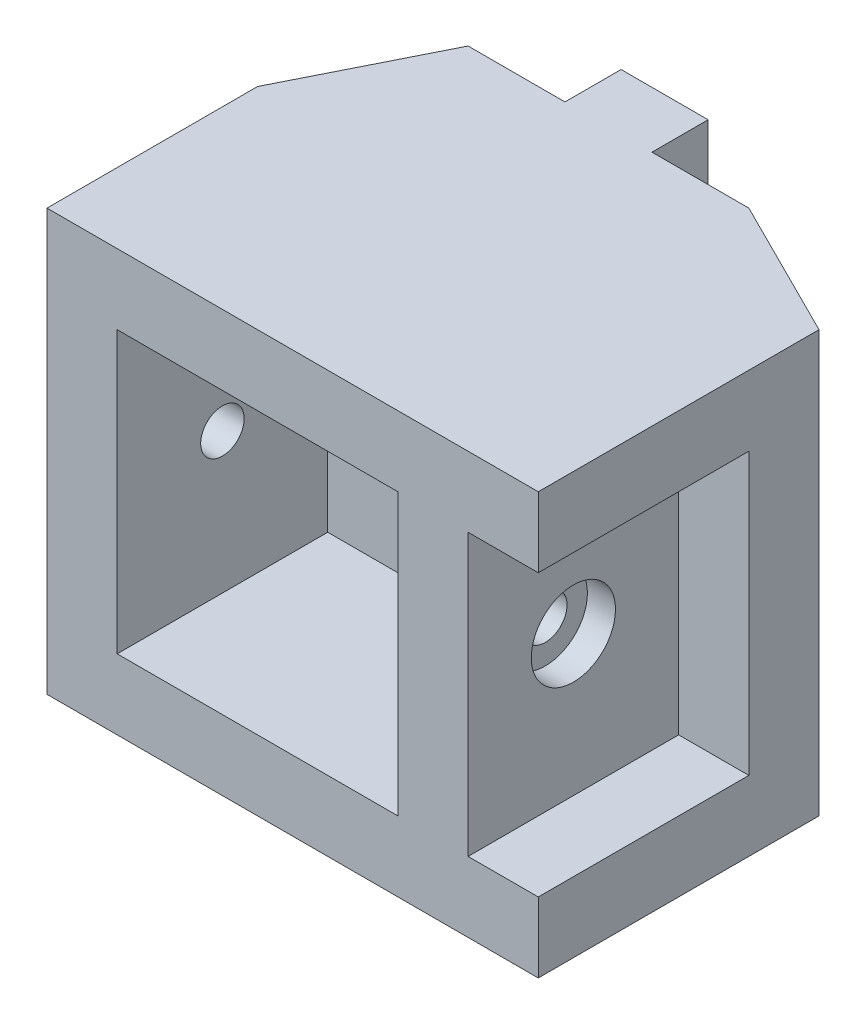
ISO-10303-21;
HEADER;
FILE_DESCRIPTION(('STEP AP214'),'2;1');
FILE_NAME('part.step','',(''),(''),'','','');
FILE_SCHEMA(('AUTOMOTIVE_DESIGN { 1 0 10303 214 1 1 1 1 }'));
ENDSEC;
DATA;
#1=APPLICATION_CONTEXT('core data for automotive mechanical design processes');
#2=APPLICATION_PROTOCOL_DEFINITION('international standard','automotive_design',2000,#1);
#3=PRODUCT_CONTEXT('',#1,'mechanical');
#4=PRODUCT('Part','Part','',(#3));
#5=PRODUCT_RELATED_PRODUCT_CATEGORY('part','',(#4));
#6=PRODUCT_DEFINITION_FORMATION('','',#4);
#7=PRODUCT_DEFINITION_CONTEXT('part definition',#1,'design');
#8=PRODUCT_DEFINITION('design','',#6,#7);
#9=PRODUCT_DEFINITION_SHAPE('','',#8);
#10=(LENGTH_UNIT() NAMED_UNIT(*) SI_UNIT(.MILLI.,.METRE.));
#11=(NAMED_UNIT(*) PLANE_ANGLE_UNIT() SI_UNIT($,.RADIAN.));
#12=(NAMED_UNIT(*) SI_UNIT($,.STERADIAN.) SOLID_ANGLE_UNIT());
#13=UNCERTAINTY_MEASURE_WITH_UNIT(LENGTH_MEASURE(1.E-05),#10,'distance_accuracy_value','');
#14=(GEOMETRIC_REPRESENTATION_CONTEXT(3) GLOBAL_UNCERTAINTY_ASSIGNED_CONTEXT((#13)) GLOBAL_UNIT_ASSIGNED_CONTEXT((#10,
#11,#12)) REPRESENTATION_CONTEXT('',''));
#15=CARTESIAN_POINT('',(0.,0.,0.));
#16=DIRECTION('',(0.,0.,1.));
#17=DIRECTION('',(1.,0.,0.));
#18=AXIS2_PLACEMENT_3D('',#15,#16,#17);
#19=CARTESIAN_POINT('',(0.,0.,4.));
#20=DIRECTION('',(0.,0.,1.));
#21=DIRECTION('',(1.,0.,0.));
#22=AXIS2_PLACEMENT_3D('',#19,#20,#21);
#23=CYLINDRICAL_SURFACE('',#22,2.6);
#24=CARTESIAN_POINT('',(0.,0.,4.));
#25=DIRECTION('',(0.,0.,1.));
#26=DIRECTION('',(1.,0.,0.));
#27=AXIS2_PLACEMENT_3D('',#24,#25,#26);
#28=CIRCLE('',#27,2.6);
#29=CARTESIAN_POINT('',(2.6,0.,4.));
#30=VERTEX_POINT('',#29);
#31=EDGE_CURVE('E297',#30,#30,#28,.T.);
#32=ORIENTED_EDGE('',*,*,#31,.F.);
#33=EDGE_LOOP('',(#32));
#34=FACE_BOUND('',#33,.T.);
#35=CARTESIAN_POINT('',(0.,0.,7.));
#36=DIRECTION('',(0.,0.,1.));
#37=DIRECTION('',(1.,0.,0.));
#38=AXIS2_PLACEMENT_3D('',#35,#36,#37);
#39=CIRCLE('',#38,2.6);
#40=CARTESIAN_POINT('',(2.6,0.,7.));
#41=VERTEX_POINT('',#40);
#42=EDGE_CURVE('E76',#41,#41,#39,.F.);
#43=ORIENTED_EDGE('',*,*,#42,.F.);
#44=EDGE_LOOP('',(#43));
#45=FACE_BOUND('',#44,.T.);
#46=ADVANCED_FACE('F72',(#34,#45),#23,.F.);
#47=CARTESIAN_POINT('',(0.,0.,0.));
#48=DIRECTION('',(0.,0.,1.));
#49=DIRECTION('',(1.,0.,0.));
#50=AXIS2_PLACEMENT_3D('',#47,#48,#49);
#51=PLANE('',#50);
#52=DIRECTION('',(1.,0.,0.));
#53=VECTOR('',#52,1.);
#54=CARTESIAN_POINT('',(0.,-15.,0.));
#55=LINE('',#54,#53);
#56=CARTESIAN_POINT('',(-3.1,-15.,0.));
#57=VERTEX_POINT('',#56);
#58=CARTESIAN_POINT('',(3.1,-15.,0.));
#59=VERTEX_POINT('',#58);
#60=EDGE_CURVE('E509',#57,#59,#55,.T.);
#61=ORIENTED_EDGE('',*,*,#60,.F.);
#62=DIRECTION('',(0.,1.,0.));
#63=VECTOR('',#62,1.);
#64=CARTESIAN_POINT('',(-3.1,-22.,0.));
#65=LINE('',#64,#63);
#66=CARTESIAN_POINT('',(-3.1,-3.1,0.));
#67=VERTEX_POINT('',#66);
#68=EDGE_CURVE('E327',#57,#67,#65,.T.);
#69=ORIENTED_EDGE('',*,*,#68,.T.);
#70=DIRECTION('',(-1.,0.,0.));
#71=VECTOR('',#70,1.);
#72=CARTESIAN_POINT('',(3.1,-3.1,0.));
#73=LINE('',#72,#71);
#74=CARTESIAN_POINT('',(3.1,-3.1,0.));
#75=VERTEX_POINT('',#74);
#76=EDGE_CURVE('E305',#75,#67,#73,.T.);
#77=ORIENTED_EDGE('',*,*,#76,.F.);
#78=DIRECTION('',(0.,1.,0.));
#79=VECTOR('',#78,1.);
#80=CARTESIAN_POINT('',(3.1,-22.,0.));
#81=LINE('',#80,#79);
#82=EDGE_CURVE('E333',#59,#75,#81,.T.);
#83=ORIENTED_EDGE('',*,*,#82,.F.);
#84=EDGE_LOOP('',(#61,#69,#77,#83));
#85=FACE_BOUND('',#84,.T.);
#86=ADVANCED_FACE('F74',(#85),#51,.F.);
#87=CARTESIAN_POINT('',(3.1,-22.,0.));
#88=DIRECTION('',(1.,0.,0.));
#89=DIRECTION('',(0.,0.,-1.));
#90=AXIS2_PLACEMENT_3D('',#87,#88,#89);
#91=PLANE('',#90);
#92=DIRECTION('',(0.,1.,0.));
#93=VECTOR('',#92,1.);
#94=CARTESIAN_POINT('',(3.1,-22.,4.));
#95=LINE('',#94,#93);
#96=CARTESIAN_POINT('',(3.1,-15.,4.));
#97=VERTEX_POINT('',#96);
#98=CARTESIAN_POINT('',(3.1,-3.1,4.));
#99=VERTEX_POINT('',#98);
#100=EDGE_CURVE('E336',#97,#99,#95,.T.);
#101=ORIENTED_EDGE('',*,*,#100,.F.);
#102=DIRECTION('',(0.,0.,-1.));
#103=VECTOR('',#102,1.);
#104=CARTESIAN_POINT('',(3.1,-15.,0.));
#105=LINE('',#104,#103);
#106=EDGE_CURVE('E513',#97,#59,#105,.T.);
#107=ORIENTED_EDGE('',*,*,#106,.T.);
#108=ORIENTED_EDGE('',*,*,#82,.T.);
#109=DIRECTION('',(0.,0.,-1.));
#110=VECTOR('',#109,1.);
#111=CARTESIAN_POINT('',(3.1,-3.1,4.));
#112=LINE('',#111,#110);
#113=EDGE_CURVE('E318',#99,#75,#112,.T.);
#114=ORIENTED_EDGE('',*,*,#113,.F.);
#115=EDGE_LOOP('',(#101,#107,#108,#114));
#116=FACE_BOUND('',#115,.T.);
#117=ADVANCED_FACE('F464',(#116),#91,.T.);
#118=CARTESIAN_POINT('',(-3.1,-22.,0.));
#119=DIRECTION('',(-1.,0.,0.));
#120=DIRECTION('',(0.,0.,1.));
#121=AXIS2_PLACEMENT_3D('',#118,#119,#120);
#122=PLANE('',#121);
#123=ORIENTED_EDGE('',*,*,#68,.F.);
#124=DIRECTION('',(0.,0.,1.));
#125=VECTOR('',#124,1.);
#126=CARTESIAN_POINT('',(-3.1,-15.,0.));
#127=LINE('',#126,#125);
#128=CARTESIAN_POINT('',(-3.1,-15.,4.));
#129=VERTEX_POINT('',#128);
#130=EDGE_CURVE('E507',#57,#129,#127,.T.);
#131=ORIENTED_EDGE('',*,*,#130,.T.);
#132=DIRECTION('',(0.,1.,0.));
#133=VECTOR('',#132,1.);
#134=CARTESIAN_POINT('',(-3.1,-22.,4.));
#135=LINE('',#134,#133);
#136=CARTESIAN_POINT('',(-3.1,-3.1,4.));
#137=VERTEX_POINT('',#136);
#138=EDGE_CURVE('E323',#129,#137,#135,.T.);
#139=ORIENTED_EDGE('',*,*,#138,.T.);
#140=DIRECTION('',(0.,0.,-1.));
#141=VECTOR('',#140,1.);
#142=CARTESIAN_POINT('',(-3.1,-3.1,4.));
#143=LINE('',#142,#141);
#144=EDGE_CURVE('E315',#137,#67,#143,.T.);
#145=ORIENTED_EDGE('',*,*,#144,.T.);
#146=EDGE_LOOP('',(#123,#131,#139,#145));
#147=FACE_BOUND('',#146,.T.);
#148=ADVANCED_FACE('F481',(#147),#122,.T.);
#149=CARTESIAN_POINT('',(0.,-22.,4.));
#150=DIRECTION('',(0.,0.,-1.));
#151=DIRECTION('',(-1.,0.,0.));
#152=AXIS2_PLACEMENT_3D('',#149,#150,#151);
#153=PLANE('',#152);
#154=DIRECTION('',(-1.,0.,0.));
#155=VECTOR('',#154,1.);
#156=CARTESIAN_POINT('',(0.,15.,4.));
#157=LINE('',#156,#155);
#158=CARTESIAN_POINT('',(10.,15.,4.));
#159=VERTEX_POINT('',#158);
#160=CARTESIAN_POINT('',(3.1,15.,4.));
#161=VERTEX_POINT('',#160);
#162=EDGE_CURVE('E230',#159,#161,#157,.T.);
#163=ORIENTED_EDGE('',*,*,#162,.F.);
#164=DIRECTION('',(0.,1.,0.));
#165=VECTOR('',#164,1.);
#166=CARTESIAN_POINT('',(10.,-22.,4.));
#167=LINE('',#166,#165);
#168=CARTESIAN_POINT('',(10.,-15.,3.99999999999999));
#169=VERTEX_POINT('',#168);
#170=EDGE_CURVE('E330',#169,#159,#167,.T.);
#171=ORIENTED_EDGE('',*,*,#170,.F.);
#172=DIRECTION('',(-1.,0.,0.));
#173=VECTOR('',#172,1.);
#174=CARTESIAN_POINT('',(0.,-15.,4.));
#175=LINE('',#174,#173);
#176=EDGE_CURVE('E360',#169,#97,#175,.T.);
#177=ORIENTED_EDGE('',*,*,#176,.T.);
#178=ORIENTED_EDGE('',*,*,#100,.T.);
#179=DIRECTION('',(-1.,0.,0.));
#180=VECTOR('',#179,1.);
#181=CARTESIAN_POINT('',(3.1,-3.1,4.));
#182=LINE('',#181,#180);
#183=EDGE_CURVE('E304',#99,#137,#182,.T.);
#184=ORIENTED_EDGE('',*,*,#183,.T.);
#185=ORIENTED_EDGE('',*,*,#138,.F.);
#186=CARTESIAN_POINT('',(-10.,-15.,4.));
#187=VERTEX_POINT('',#186);
#188=EDGE_CURVE('E231',#129,#187,#175,.T.);
#189=ORIENTED_EDGE('',*,*,#188,.T.);
#190=DIRECTION('',(0.,1.,0.));
#191=VECTOR('',#190,1.);
#192=CARTESIAN_POINT('',(-10.,-22.,4.));
#193=LINE('',#192,#191);
#194=CARTESIAN_POINT('',(-10.,15.,4.));
#195=VERTEX_POINT('',#194);
#196=EDGE_CURVE('E227',#187,#195,#193,.T.);
#197=ORIENTED_EDGE('',*,*,#196,.T.);
#198=CARTESIAN_POINT('',(-3.1,15.,4.));
#199=VERTEX_POINT('',#198);
#200=EDGE_CURVE('E368',#199,#195,#157,.T.);
#201=ORIENTED_EDGE('',*,*,#200,.F.);
#202=CARTESIAN_POINT('',(-3.1,3.1,4.));
#203=VERTEX_POINT('',#202);
#204=EDGE_CURVE('E325',#203,#199,#135,.T.);
#205=ORIENTED_EDGE('',*,*,#204,.F.);
#206=DIRECTION('',(1.,0.,0.));
#207=VECTOR('',#206,1.);
#208=CARTESIAN_POINT('',(-3.1,3.1,4.));
#209=LINE('',#208,#207);
#210=CARTESIAN_POINT('',(3.1,3.1,4.));
#211=VERTEX_POINT('',#210);
#212=EDGE_CURVE('E301',#203,#211,#209,.T.);
#213=ORIENTED_EDGE('',*,*,#212,.T.);
#214=EDGE_CURVE('E314',#211,#161,#95,.T.);
#215=ORIENTED_EDGE('',*,*,#214,.T.);
#216=EDGE_LOOP('',(#163,#171,#177,#178,#184,#185,#189,#197,#201,#205,#213,#215));
#217=FACE_BOUND('',#216,.T.);
#218=ORIENTED_EDGE('',*,*,#31,.T.);
#219=EDGE_LOOP('',(#218));
#220=FACE_BOUND('',#219,.T.);
#221=ADVANCED_FACE('F358',(#217,#220),#153,.T.);
#222=CARTESIAN_POINT('',(-6.4,-22.,-3.2));
#223=DIRECTION('',(0.894427190999916,0.,0.447213595499958));
#224=DIRECTION('',(0.447213595499958,0.,-0.894427190999916));
#225=AXIS2_PLACEMENT_3D('',#222,#223,#224);
#226=PLANE('',#225);
#227=DIRECTION('',(0.,-1.,0.));
#228=VECTOR('',#227,1.);
#229=CARTESIAN_POINT('',(-15.,0.,14.));
#230=LINE('',#229,#228);
#231=CARTESIAN_POINT('',(-15.,15.,14.));
#232=VERTEX_POINT('',#231);
#233=CARTESIAN_POINT('',(-15.,-15.,14.));
#234=VERTEX_POINT('',#233);
#235=EDGE_CURVE('E225',#232,#234,#230,.T.);
#236=ORIENTED_EDGE('',*,*,#235,.F.);
#237=DIRECTION('',(0.447213595499958,0.,-0.894427190999916));
#238=VECTOR('',#237,1.);
#239=CARTESIAN_POINT('',(-6.4,15.,-3.2));
#240=LINE('',#239,#238);
#241=EDGE_CURVE('E371',#232,#195,#240,.T.);
#242=ORIENTED_EDGE('',*,*,#241,.T.);
#243=ORIENTED_EDGE('',*,*,#196,.F.);
#244=DIRECTION('',(0.447213595499958,0.,-0.894427190999916));
#245=VECTOR('',#244,1.);
#246=CARTESIAN_POINT('',(-6.4,-15.,-3.2));
#247=LINE('',#246,#245);
#248=EDGE_CURVE('E220',#234,#187,#247,.T.);
#249=ORIENTED_EDGE('',*,*,#248,.F.);
#250=EDGE_LOOP('',(#236,#242,#243,#249));
#251=FACE_BOUND('',#250,.T.);
#252=ADVANCED_FACE('F222',(#251),#226,.F.);
#253=CARTESIAN_POINT('',(20.,22.,9.));
#254=DIRECTION('',(1.,0.,0.));
#255=DIRECTION('',(0.,1.,0.));
#256=AXIS2_PLACEMENT_3D('',#253,#254,#255);
#257=PLANE('',#256);
#258=DIRECTION('',(0.,-1.,0.));
#259=VECTOR('',#258,1.);
#260=CARTESIAN_POINT('',(20.,22.,9.));
#261=LINE('',#260,#259);
#262=CARTESIAN_POINT('',(20.,15.,9.));
#263=VERTEX_POINT('',#262);
#264=CARTESIAN_POINT('',(20.,-15.,9.));
#265=VERTEX_POINT('',#264);
#266=EDGE_CURVE('E277',#263,#265,#261,.T.);
#267=ORIENTED_EDGE('',*,*,#266,.F.);
#268=DIRECTION('',(0.,0.,-1.));
#269=VECTOR('',#268,1.);
#270=CARTESIAN_POINT('',(20.,15.,29.));
#271=LINE('',#270,#269);
#272=CARTESIAN_POINT('',(20.,15.,29.));
#273=VERTEX_POINT('',#272);
#274=EDGE_CURVE('E286',#273,#263,#271,.T.);
#275=ORIENTED_EDGE('',*,*,#274,.F.);
#276=DIRECTION('',(0.,1.,0.));
#277=VECTOR('',#276,1.);
#278=CARTESIAN_POINT('',(20.,0.,29.));
#279=LINE('',#278,#277);
#280=CARTESIAN_POINT('',(20.,10.,29.));
#281=VERTEX_POINT('',#280);
#282=EDGE_CURVE('E401',#281,#273,#279,.T.);
#283=ORIENTED_EDGE('',*,*,#282,.F.);
#284=DIRECTION('',(0.,0.,-1.));
#285=VECTOR('',#284,1.);
#286=CARTESIAN_POINT('',(20.,10.,29.));
#287=LINE('',#286,#285);
#288=CARTESIAN_POINT('',(20.,10.,14.));
#289=VERTEX_POINT('',#288);
#290=EDGE_CURVE('E288',#281,#289,#287,.T.);
#291=ORIENTED_EDGE('',*,*,#290,.T.);
#292=DIRECTION('',(0.,-1.,0.));
#293=VECTOR('',#292,1.);
#294=CARTESIAN_POINT('',(20.,22.,14.));
#295=LINE('',#294,#293);
#296=CARTESIAN_POINT('',(20.,-9.99999999999999,14.));
#297=VERTEX_POINT('',#296);
#298=EDGE_CURVE('E294',#289,#297,#295,.T.);
#299=ORIENTED_EDGE('',*,*,#298,.T.);
#300=DIRECTION('',(0.,0.,-1.));
#301=VECTOR('',#300,1.);
#302=CARTESIAN_POINT('',(20.,-9.99999999999999,29.));
#303=LINE('',#302,#301);
#304=CARTESIAN_POINT('',(20.,-9.99999999999999,29.));
#305=VERTEX_POINT('',#304);
#306=EDGE_CURVE('E280',#305,#297,#303,.T.);
#307=ORIENTED_EDGE('',*,*,#306,.F.);
#308=DIRECTION('',(0.,1.,0.));
#309=VECTOR('',#308,1.);
#310=CARTESIAN_POINT('',(20.,0.,29.));
#311=LINE('',#310,#309);
#312=CARTESIAN_POINT('',(20.,-15.,29.));
#313=VERTEX_POINT('',#312);
#314=EDGE_CURVE('E407',#313,#305,#311,.T.);
#315=ORIENTED_EDGE('',*,*,#314,.F.);
#316=DIRECTION('',(0.,0.,-1.));
#317=VECTOR('',#316,1.);
#318=CARTESIAN_POINT('',(20.,-15.,29.));
#319=LINE('',#318,#317);
#320=EDGE_CURVE('E242',#313,#265,#319,.T.);
#321=ORIENTED_EDGE('',*,*,#320,.T.);
#322=EDGE_LOOP('',(#267,#275,#283,#291,#299,#307,#315,#321));
#323=FACE_BOUND('',#322,.T.);
#324=ADVANCED_FACE('F470',(#323),#257,.T.);
#325=CARTESIAN_POINT('',(10.,22.,4.));
#326=DIRECTION('',(0.447213595499958,0.,-0.894427190999916));
#327=DIRECTION('',(-0.894427190999916,0.,-0.447213595499958));
#328=AXIS2_PLACEMENT_3D('',#325,#326,#327);
#329=PLANE('',#328);
#330=DIRECTION('',(-0.894427190999916,0.,-0.447213595499958));
#331=VECTOR('',#330,1.);
#332=CARTESIAN_POINT('',(10.,15.,4.));
#333=LINE('',#332,#331);
#334=EDGE_CURVE('E12',#263,#159,#333,.T.);
#335=ORIENTED_EDGE('',*,*,#334,.F.);
#336=ORIENTED_EDGE('',*,*,#266,.T.);
#337=DIRECTION('',(-0.894427190999916,0.,-0.447213595499958));
#338=VECTOR('',#337,1.);
#339=CARTESIAN_POINT('',(10.,-15.,3.99999999999999));
#340=LINE('',#339,#338);
#341=EDGE_CURVE('E81',#265,#169,#340,.T.);
#342=ORIENTED_EDGE('',*,*,#341,.T.);
#343=ORIENTED_EDGE('',*,*,#170,.T.);
#344=EDGE_LOOP('',(#335,#336,#342,#343));
#345=FACE_BOUND('',#344,.T.);
#346=ADVANCED_FACE('F353',(#345),#329,.T.);
#347=CARTESIAN_POINT('',(-20.,0.,21.5));
#348=DIRECTION('',(1.,0.,0.));
#349=DIRECTION('',(0.,0.,-1.));
#350=AXIS2_PLACEMENT_3D('',#347,#348,#349);
#351=CYLINDRICAL_SURFACE('',#350,1.55);
#352=CARTESIAN_POINT('',(-10.,0.,21.5));
#353=DIRECTION('',(1.,0.,0.));
#354=DIRECTION('',(0.,0.,-1.));
#355=AXIS2_PLACEMENT_3D('',#352,#353,#354);
#356=CIRCLE('',#355,1.55);
#357=CARTESIAN_POINT('',(-10.,0.,19.95));
#358=VERTEX_POINT('',#357);
#359=EDGE_CURVE('E394',#358,#358,#356,.T.);
#360=ORIENTED_EDGE('',*,*,#359,.T.);
#361=EDGE_LOOP('',(#360));
#362=FACE_BOUND('',#361,.T.);
#363=CARTESIAN_POINT('',(-13.,0.,21.5));
#364=DIRECTION('',(-1.,0.,0.));
#365=DIRECTION('',(0.,-1.,0.));
#366=AXIS2_PLACEMENT_3D('',#363,#364,#365);
#367=CIRCLE('',#366,1.55);
#368=CARTESIAN_POINT('',(-13.,-1.55,21.5));
#369=VERTEX_POINT('',#368);
#370=EDGE_CURVE('E343',#369,#369,#367,.F.);
#371=ORIENTED_EDGE('',*,*,#370,.F.);
#372=EDGE_LOOP('',(#371));
#373=FACE_BOUND('',#372,.T.);
#374=ADVANCED_FACE('F450',(#362,#373),#351,.F.);
#375=CARTESIAN_POINT('',(15.,0.,21.5));
#376=DIRECTION('',(-1.,0.,0.));
#377=DIRECTION('',(0.,-1.,0.));
#378=AXIS2_PLACEMENT_3D('',#375,#376,#377);
#379=CYLINDRICAL_SURFACE('',#378,1.55);
#380=CARTESIAN_POINT('',(10.,0.,21.5));
#381=DIRECTION('',(1.,0.,0.));
#382=DIRECTION('',(0.,0.,-1.));
#383=AXIS2_PLACEMENT_3D('',#380,#381,#382);
#384=CIRCLE('',#383,1.55);
#385=CARTESIAN_POINT('',(10.,0.,19.95));
#386=VERTEX_POINT('',#385);
#387=EDGE_CURVE('E341',#386,#386,#384,.F.);
#388=ORIENTED_EDGE('',*,*,#387,.T.);
#389=EDGE_LOOP('',(#388));
#390=FACE_BOUND('',#389,.T.);
#391=CARTESIAN_POINT('',(13.,0.,21.5));
#392=DIRECTION('',(1.,0.,0.));
#393=DIRECTION('',(0.,0.,-1.));
#394=AXIS2_PLACEMENT_3D('',#391,#392,#393);
#395=CIRCLE('',#394,1.55);
#396=CARTESIAN_POINT('',(13.,0.,19.95));
#397=VERTEX_POINT('',#396);
#398=EDGE_CURVE('E338',#397,#397,#395,.T.);
#399=ORIENTED_EDGE('',*,*,#398,.T.);
#400=EDGE_LOOP('',(#399));
#401=FACE_BOUND('',#400,.T.);
#402=ADVANCED_FACE('F441',(#390,#401),#379,.F.);
#403=CARTESIAN_POINT('',(0.,0.,14.));
#404=DIRECTION('',(0.,0.,1.));
#405=DIRECTION('',(1.,0.,0.));
#406=AXIS2_PLACEMENT_3D('',#403,#404,#405);
#407=PLANE('',#406);
#408=CARTESIAN_POINT('',(0.,0.,14.));
#409=DIRECTION('',(0.,0.,1.));
#410=DIRECTION('',(1.,0.,0.));
#411=AXIS2_PLACEMENT_3D('',#408,#409,#410);
#412=CIRCLE('',#411,5.);
#413=CARTESIAN_POINT('',(5.,0.,14.));
#414=VERTEX_POINT('',#413);
#415=EDGE_CURVE('E520',#414,#414,#412,.T.);
#416=ORIENTED_EDGE('',*,*,#415,.F.);
#417=EDGE_LOOP('',(#416));
#418=FACE_BOUND('',#417,.T.);
#419=DIRECTION('',(0.,-1.,0.));
#420=VECTOR('',#419,1.);
#421=CARTESIAN_POINT('',(10.,0.,14.));
#422=LINE('',#421,#420);
#423=CARTESIAN_POINT('',(10.,10.,14.));
#424=VERTEX_POINT('',#423);
#425=CARTESIAN_POINT('',(10.,-10.,14.));
#426=VERTEX_POINT('',#425);
#427=EDGE_CURVE('E255',#424,#426,#422,.T.);
#428=ORIENTED_EDGE('',*,*,#427,.F.);
#429=DIRECTION('',(-1.,0.,0.));
#430=VECTOR('',#429,1.);
#431=CARTESIAN_POINT('',(0.,10.,14.));
#432=LINE('',#431,#430);
#433=CARTESIAN_POINT('',(-10.,10.,14.));
#434=VERTEX_POINT('',#433);
#435=EDGE_CURVE('E249',#424,#434,#432,.T.);
#436=ORIENTED_EDGE('',*,*,#435,.T.);
#437=DIRECTION('',(0.,1.,0.));
#438=VECTOR('',#437,1.);
#439=CARTESIAN_POINT('',(-10.,0.,14.));
#440=LINE('',#439,#438);
#441=CARTESIAN_POINT('',(-10.,-10.,14.));
#442=VERTEX_POINT('',#441);
#443=EDGE_CURVE('E260',#442,#434,#440,.T.);
#444=ORIENTED_EDGE('',*,*,#443,.F.);
#445=DIRECTION('',(1.,0.,0.));
#446=VECTOR('',#445,1.);
#447=CARTESIAN_POINT('',(0.,-10.,14.));
#448=LINE('',#447,#446);
#449=EDGE_CURVE('E258',#442,#426,#448,.T.);
#450=ORIENTED_EDGE('',*,*,#449,.T.);
#451=EDGE_LOOP('',(#428,#436,#444,#450));
#452=FACE_BOUND('',#451,.T.);
#453=ADVANCED_FACE('F438',(#418,#452),#407,.T.);
#454=CARTESIAN_POINT('',(-3.1,3.1,0.));
#455=VERTEX_POINT('',#454);
#456=CARTESIAN_POINT('',(-3.1,15.,0.));
#457=VERTEX_POINT('',#456);
#458=EDGE_CURVE('E329',#455,#457,#65,.T.);
#459=ORIENTED_EDGE('',*,*,#458,.T.);
#460=DIRECTION('',(1.,0.,0.));
#461=VECTOR('',#460,1.);
#462=CARTESIAN_POINT('',(0.,15.,0.));
#463=LINE('',#462,#461);
#464=CARTESIAN_POINT('',(3.1,15.,0.));
#465=VERTEX_POINT('',#464);
#466=EDGE_CURVE('E369',#457,#465,#463,.T.);
#467=ORIENTED_EDGE('',*,*,#466,.T.);
#468=CARTESIAN_POINT('',(3.1,3.1,0.));
#469=VERTEX_POINT('',#468);
#470=EDGE_CURVE('E335',#469,#465,#81,.T.);
#471=ORIENTED_EDGE('',*,*,#470,.F.);
#472=DIRECTION('',(1.,0.,0.));
#473=VECTOR('',#472,1.);
#474=CARTESIAN_POINT('',(-3.1,3.1,0.));
#475=LINE('',#474,#473);
#476=EDGE_CURVE('E300',#455,#469,#475,.T.);
#477=ORIENTED_EDGE('',*,*,#476,.F.);
#478=EDGE_LOOP('',(#459,#467,#471,#477));
#479=FACE_BOUND('',#478,.T.);
#480=ADVANCED_FACE('F440',(#479),#51,.F.);
#481=DIRECTION('',(0.,0.,-1.));
#482=VECTOR('',#481,1.);
#483=CARTESIAN_POINT('',(3.1,15.,0.));
#484=LINE('',#483,#482);
#485=EDGE_CURVE('E366',#161,#465,#484,.T.);
#486=ORIENTED_EDGE('',*,*,#485,.F.);
#487=ORIENTED_EDGE('',*,*,#214,.F.);
#488=DIRECTION('',(0.,0.,-1.));
#489=VECTOR('',#488,1.);
#490=CARTESIAN_POINT('',(3.1,3.1,4.));
#491=LINE('',#490,#489);
#492=EDGE_CURVE('E308',#211,#469,#491,.T.);
#493=ORIENTED_EDGE('',*,*,#492,.T.);
#494=ORIENTED_EDGE('',*,*,#470,.T.);
#495=EDGE_LOOP('',(#486,#487,#493,#494));
#496=FACE_BOUND('',#495,.T.);
#497=ADVANCED_FACE('F448',(#496),#91,.T.);
#498=DIRECTION('',(0.,0.,1.));
#499=VECTOR('',#498,1.);
#500=CARTESIAN_POINT('',(-3.1,15.,0.));
#501=LINE('',#500,#499);
#502=EDGE_CURVE('E372',#457,#199,#501,.T.);
#503=ORIENTED_EDGE('',*,*,#502,.F.);
#504=ORIENTED_EDGE('',*,*,#458,.F.);
#505=DIRECTION('',(0.,0.,-1.));
#506=VECTOR('',#505,1.);
#507=CARTESIAN_POINT('',(-3.1,3.1,4.));
#508=LINE('',#507,#506);
#509=EDGE_CURVE('E312',#203,#455,#508,.T.);
#510=ORIENTED_EDGE('',*,*,#509,.F.);
#511=ORIENTED_EDGE('',*,*,#204,.T.);
#512=EDGE_LOOP('',(#503,#504,#510,#511));
#513=FACE_BOUND('',#512,.T.);
#514=ADVANCED_FACE('F457',(#513),#122,.T.);
#515=DIRECTION('',(-1.,0.,0.));
#516=VECTOR('',#515,1.);
#517=CARTESIAN_POINT('',(0.,-10.,14.));
#518=LINE('',#517,#516);
#519=CARTESIAN_POINT('',(15.,-10.,14.));
#520=VERTEX_POINT('',#519);
#521=EDGE_CURVE('E246',#297,#520,#518,.T.);
#522=ORIENTED_EDGE('',*,*,#521,.F.);
#523=ORIENTED_EDGE('',*,*,#298,.F.);
#524=DIRECTION('',(1.,0.,0.));
#525=VECTOR('',#524,1.);
#526=CARTESIAN_POINT('',(0.,10.,14.));
#527=LINE('',#526,#525);
#528=CARTESIAN_POINT('',(15.,10.,14.));
#529=VERTEX_POINT('',#528);
#530=EDGE_CURVE('E93',#529,#289,#527,.T.);
#531=ORIENTED_EDGE('',*,*,#530,.F.);
#532=DIRECTION('',(0.,-1.,0.));
#533=VECTOR('',#532,1.);
#534=CARTESIAN_POINT('',(15.,0.,14.));
#535=LINE('',#534,#533);
#536=EDGE_CURVE('E88',#529,#520,#535,.T.);
#537=ORIENTED_EDGE('',*,*,#536,.T.);
#538=EDGE_LOOP('',(#522,#523,#531,#537));
#539=FACE_BOUND('',#538,.T.);
#540=ADVANCED_FACE('F443',(#539),#407,.T.);
#541=CARTESIAN_POINT('',(-3.1,3.1,4.));
#542=DIRECTION('',(0.,1.,0.));
#543=DIRECTION('',(0.,0.,1.));
#544=AXIS2_PLACEMENT_3D('',#541,#542,#543);
#545=PLANE('',#544);
#546=ORIENTED_EDGE('',*,*,#476,.T.);
#547=ORIENTED_EDGE('',*,*,#492,.F.);
#548=ORIENTED_EDGE('',*,*,#212,.F.);
#549=ORIENTED_EDGE('',*,*,#509,.T.);
#550=EDGE_LOOP('',(#546,#547,#548,#549));
#551=FACE_BOUND('',#550,.T.);
#552=ADVANCED_FACE('F456',(#551),#545,.F.);
#553=CARTESIAN_POINT('',(3.1,-3.1,4.));
#554=DIRECTION('',(0.,-1.,0.));
#555=DIRECTION('',(1.,0.,0.));
#556=AXIS2_PLACEMENT_3D('',#553,#554,#555);
#557=PLANE('',#556);
#558=ORIENTED_EDGE('',*,*,#76,.T.);
#559=ORIENTED_EDGE('',*,*,#144,.F.);
#560=ORIENTED_EDGE('',*,*,#183,.F.);
#561=ORIENTED_EDGE('',*,*,#113,.T.);
#562=EDGE_LOOP('',(#558,#559,#560,#561));
#563=FACE_BOUND('',#562,.T.);
#564=ADVANCED_FACE('F472',(#563),#557,.F.);
#565=CARTESIAN_POINT('',(0.,10.,29.));
#566=DIRECTION('',(0.,-1.,0.));
#567=DIRECTION('',(0.,0.,-1.));
#568=AXIS2_PLACEMENT_3D('',#565,#566,#567);
#569=PLANE('',#568);
#570=ORIENTED_EDGE('',*,*,#435,.F.);
#571=DIRECTION('',(0.,0.,-1.));
#572=VECTOR('',#571,1.);
#573=CARTESIAN_POINT('',(10.,10.,29.));
#574=LINE('',#573,#572);
#575=CARTESIAN_POINT('',(10.,10.,29.));
#576=VERTEX_POINT('',#575);
#577=EDGE_CURVE('E274',#576,#424,#574,.T.);
#578=ORIENTED_EDGE('',*,*,#577,.F.);
#579=DIRECTION('',(-1.,0.,0.));
#580=VECTOR('',#579,1.);
#581=CARTESIAN_POINT('',(0.,10.,29.));
#582=LINE('',#581,#580);
#583=CARTESIAN_POINT('',(-10.,10.,29.));
#584=VERTEX_POINT('',#583);
#585=EDGE_CURVE('E411',#576,#584,#582,.T.);
#586=ORIENTED_EDGE('',*,*,#585,.T.);
#587=DIRECTION('',(0.,0.,-1.));
#588=VECTOR('',#587,1.);
#589=CARTESIAN_POINT('',(-10.,10.,29.));
#590=LINE('',#589,#588);
#591=EDGE_CURVE('E264',#584,#434,#590,.T.);
#592=ORIENTED_EDGE('',*,*,#591,.T.);
#593=EDGE_LOOP('',(#570,#578,#586,#592));
#594=FACE_BOUND('',#593,.T.);
#595=ADVANCED_FACE('F429',(#594),#569,.T.);
#596=CARTESIAN_POINT('',(10.,0.,29.));
#597=DIRECTION('',(1.,0.,0.));
#598=DIRECTION('',(0.,0.,-1.));
#599=AXIS2_PLACEMENT_3D('',#596,#597,#598);
#600=PLANE('',#599);
#601=ORIENTED_EDGE('',*,*,#387,.F.);
#602=EDGE_LOOP('',(#601));
#603=FACE_BOUND('',#602,.T.);
#604=ORIENTED_EDGE('',*,*,#427,.T.);
#605=DIRECTION('',(0.,0.,-1.));
#606=VECTOR('',#605,1.);
#607=CARTESIAN_POINT('',(10.,-10.,29.));
#608=LINE('',#607,#606);
#609=CARTESIAN_POINT('',(10.,-10.,29.));
#610=VERTEX_POINT('',#609);
#611=EDGE_CURVE('E271',#610,#426,#608,.T.);
#612=ORIENTED_EDGE('',*,*,#611,.F.);
#613=DIRECTION('',(0.,-1.,0.));
#614=VECTOR('',#613,1.);
#615=CARTESIAN_POINT('',(10.,0.,29.));
#616=LINE('',#615,#614);
#617=EDGE_CURVE('E414',#576,#610,#616,.T.);
#618=ORIENTED_EDGE('',*,*,#617,.F.);
#619=ORIENTED_EDGE('',*,*,#577,.T.);
#620=EDGE_LOOP('',(#604,#612,#618,#619));
#621=FACE_BOUND('',#620,.T.);
#622=ADVANCED_FACE('F433',(#603,#621),#600,.F.);
#623=CARTESIAN_POINT('',(0.,-10.,29.));
#624=DIRECTION('',(0.,1.,0.));
#625=DIRECTION('',(0.,0.,1.));
#626=AXIS2_PLACEMENT_3D('',#623,#624,#625);
#627=PLANE('',#626);
#628=ORIENTED_EDGE('',*,*,#449,.F.);
#629=DIRECTION('',(0.,0.,-1.));
#630=VECTOR('',#629,1.);
#631=CARTESIAN_POINT('',(-10.,-10.,29.));
#632=LINE('',#631,#630);
#633=CARTESIAN_POINT('',(-10.,-10.,29.));
#634=VERTEX_POINT('',#633);
#635=EDGE_CURVE('E267',#634,#442,#632,.T.);
#636=ORIENTED_EDGE('',*,*,#635,.F.);
#637=DIRECTION('',(1.,0.,0.));
#638=VECTOR('',#637,1.);
#639=CARTESIAN_POINT('',(0.,-10.,29.));
#640=LINE('',#639,#638);
#641=EDGE_CURVE('E416',#634,#610,#640,.T.);
#642=ORIENTED_EDGE('',*,*,#641,.T.);
#643=ORIENTED_EDGE('',*,*,#611,.T.);
#644=EDGE_LOOP('',(#628,#636,#642,#643));
#645=FACE_BOUND('',#644,.T.);
#646=ADVANCED_FACE('F436',(#645),#627,.T.);
#647=CARTESIAN_POINT('',(15.,0.,29.));
#648=DIRECTION('',(1.,0.,0.));
#649=DIRECTION('',(0.,0.,-1.));
#650=AXIS2_PLACEMENT_3D('',#647,#648,#649);
#651=PLANE('',#650);
#652=CARTESIAN_POINT('',(15.,0.,21.5));
#653=DIRECTION('',(1.,0.,0.));
#654=DIRECTION('',(0.,0.,-1.));
#655=AXIS2_PLACEMENT_3D('',#652,#653,#654);
#656=CIRCLE('',#655,3.);
#657=CARTESIAN_POINT('',(15.,0.,18.5));
#658=VERTEX_POINT('',#657);
#659=EDGE_CURVE('E346',#658,#658,#656,.T.);
#660=ORIENTED_EDGE('',*,*,#659,.F.);
#661=EDGE_LOOP('',(#660));
#662=FACE_BOUND('',#661,.T.);
#663=ORIENTED_EDGE('',*,*,#536,.F.);
#664=DIRECTION('',(0.,0.,-1.));
#665=VECTOR('',#664,1.);
#666=CARTESIAN_POINT('',(15.,10.,29.));
#667=LINE('',#666,#665);
#668=CARTESIAN_POINT('',(15.,10.,29.));
#669=VERTEX_POINT('',#668);
#670=EDGE_CURVE('E268',#669,#529,#667,.T.);
#671=ORIENTED_EDGE('',*,*,#670,.F.);
#672=DIRECTION('',(0.,-1.,0.));
#673=VECTOR('',#672,1.);
#674=CARTESIAN_POINT('',(15.,0.,29.));
#675=LINE('',#674,#673);
#676=CARTESIAN_POINT('',(15.,-10.,29.));
#677=VERTEX_POINT('',#676);
#678=EDGE_CURVE('E263',#669,#677,#675,.T.);
#679=ORIENTED_EDGE('',*,*,#678,.T.);
#680=DIRECTION('',(0.,0.,-1.));
#681=VECTOR('',#680,1.);
#682=CARTESIAN_POINT('',(15.,-10.,29.));
#683=LINE('',#682,#681);
#684=EDGE_CURVE('E278',#677,#520,#683,.T.);
#685=ORIENTED_EDGE('',*,*,#684,.T.);
#686=EDGE_LOOP('',(#663,#671,#679,#685));
#687=FACE_BOUND('',#686,.T.);
#688=ADVANCED_FACE('F564',(#662,#687),#651,.T.);
#689=CARTESIAN_POINT('',(0.,10.,29.));
#690=DIRECTION('',(0.,1.,0.));
#691=DIRECTION('',(0.,0.,1.));
#692=AXIS2_PLACEMENT_3D('',#689,#690,#691);
#693=PLANE('',#692);
#694=ORIENTED_EDGE('',*,*,#530,.T.);
#695=ORIENTED_EDGE('',*,*,#290,.F.);
#696=DIRECTION('',(1.,0.,0.));
#697=VECTOR('',#696,1.);
#698=CARTESIAN_POINT('',(0.,10.,29.));
#699=LINE('',#698,#697);
#700=EDGE_CURVE('E399',#669,#281,#699,.T.);
#701=ORIENTED_EDGE('',*,*,#700,.F.);
#702=ORIENTED_EDGE('',*,*,#670,.T.);
#703=EDGE_LOOP('',(#694,#695,#701,#702));
#704=FACE_BOUND('',#703,.T.);
#705=ADVANCED_FACE('F580',(#704),#693,.F.);
#706=CARTESIAN_POINT('',(0.,15.,29.));
#707=DIRECTION('',(0.,1.,0.));
#708=DIRECTION('',(0.,0.,1.));
#709=AXIS2_PLACEMENT_3D('',#706,#707,#708);
#710=PLANE('',#709);
#711=ORIENTED_EDGE('',*,*,#274,.T.);
#712=ORIENTED_EDGE('',*,*,#334,.T.);
#713=ORIENTED_EDGE('',*,*,#162,.T.);
#714=ORIENTED_EDGE('',*,*,#485,.T.);
#715=ORIENTED_EDGE('',*,*,#466,.F.);
#716=ORIENTED_EDGE('',*,*,#502,.T.);
#717=ORIENTED_EDGE('',*,*,#200,.T.);
#718=ORIENTED_EDGE('',*,*,#241,.F.);
#719=DIRECTION('',(0.,0.,-1.));
#720=VECTOR('',#719,1.);
#721=CARTESIAN_POINT('',(-15.,15.,29.));
#722=LINE('',#721,#720);
#723=CARTESIAN_POINT('',(-15.,15.,29.));
#724=VERTEX_POINT('',#723);
#725=EDGE_CURVE('E241',#724,#232,#722,.T.);
#726=ORIENTED_EDGE('',*,*,#725,.F.);
#727=DIRECTION('',(1.,0.,0.));
#728=VECTOR('',#727,1.);
#729=CARTESIAN_POINT('',(-15.,15.,29.));
#730=LINE('',#729,#728);
#731=EDGE_CURVE('E374',#724,#273,#730,.T.);
#732=ORIENTED_EDGE('',*,*,#731,.T.);
#733=EDGE_LOOP('',(#711,#712,#713,#714,#715,#716,#717,#718,#726,#732));
#734=FACE_BOUND('',#733,.T.);
#735=ADVANCED_FACE('F498',(#734),#710,.T.);
#736=CARTESIAN_POINT('',(-15.,0.,29.));
#737=DIRECTION('',(1.,0.,0.));
#738=DIRECTION('',(0.,1.,0.));
#739=AXIS2_PLACEMENT_3D('',#736,#737,#738);
#740=PLANE('',#739);
#741=CARTESIAN_POINT('',(-15.,0.,21.5));
#742=DIRECTION('',(-1.,0.,0.));
#743=DIRECTION('',(0.,-1.,0.));
#744=AXIS2_PLACEMENT_3D('',#741,#742,#743);
#745=CIRCLE('',#744,3.);
#746=CARTESIAN_POINT('',(-15.,-3.,21.5));
#747=VERTEX_POINT('',#746);
#748=EDGE_CURVE('E383',#747,#747,#745,.T.);
#749=ORIENTED_EDGE('',*,*,#748,.F.);
#750=EDGE_LOOP('',(#749));
#751=FACE_BOUND('',#750,.T.);
#752=DIRECTION('',(0.,-1.,0.));
#753=VECTOR('',#752,1.);
#754=CARTESIAN_POINT('',(-15.,0.,29.));
#755=LINE('',#754,#753);
#756=CARTESIAN_POINT('',(-15.,-15.,29.));
#757=VERTEX_POINT('',#756);
#758=EDGE_CURVE('E404',#724,#757,#755,.T.);
#759=ORIENTED_EDGE('',*,*,#758,.F.);
#760=ORIENTED_EDGE('',*,*,#725,.T.);
#761=ORIENTED_EDGE('',*,*,#235,.T.);
#762=DIRECTION('',(0.,0.,-1.));
#763=VECTOR('',#762,1.);
#764=CARTESIAN_POINT('',(-15.,-15.,29.));
#765=LINE('',#764,#763);
#766=EDGE_CURVE('E235',#757,#234,#765,.T.);
#767=ORIENTED_EDGE('',*,*,#766,.F.);
#768=EDGE_LOOP('',(#759,#760,#761,#767));
#769=FACE_BOUND('',#768,.T.);
#770=ADVANCED_FACE('F245',(#751,#769),#740,.F.);
#771=CARTESIAN_POINT('',(0.,-15.,29.));
#772=DIRECTION('',(0.,-1.,0.));
#773=DIRECTION('',(0.,0.,-1.));
#774=AXIS2_PLACEMENT_3D('',#771,#772,#773);
#775=PLANE('',#774);
#776=ORIENTED_EDGE('',*,*,#766,.T.);
#777=ORIENTED_EDGE('',*,*,#248,.T.);
#778=ORIENTED_EDGE('',*,*,#188,.F.);
#779=ORIENTED_EDGE('',*,*,#130,.F.);
#780=ORIENTED_EDGE('',*,*,#60,.T.);
#781=ORIENTED_EDGE('',*,*,#106,.F.);
#782=ORIENTED_EDGE('',*,*,#176,.F.);
#783=ORIENTED_EDGE('',*,*,#341,.F.);
#784=ORIENTED_EDGE('',*,*,#320,.F.);
#785=DIRECTION('',(-1.,0.,0.));
#786=VECTOR('',#785,1.);
#787=CARTESIAN_POINT('',(0.,-15.,29.));
#788=LINE('',#787,#786);
#789=EDGE_CURVE('E238',#313,#757,#788,.T.);
#790=ORIENTED_EDGE('',*,*,#789,.T.);
#791=EDGE_LOOP('',(#776,#777,#778,#779,#780,#781,#782,#783,#784,#790));
#792=FACE_BOUND('',#791,.T.);
#793=ADVANCED_FACE('F236',(#792),#775,.T.);
#794=CARTESIAN_POINT('',(0.,-10.,29.));
#795=DIRECTION('',(0.,-1.,0.));
#796=DIRECTION('',(1.,0.,0.));
#797=AXIS2_PLACEMENT_3D('',#794,#795,#796);
#798=PLANE('',#797);
#799=ORIENTED_EDGE('',*,*,#521,.T.);
#800=ORIENTED_EDGE('',*,*,#684,.F.);
#801=DIRECTION('',(-1.,0.,0.));
#802=VECTOR('',#801,1.);
#803=CARTESIAN_POINT('',(0.,-10.,29.));
#804=LINE('',#803,#802);
#805=EDGE_CURVE('E409',#305,#677,#804,.T.);
#806=ORIENTED_EDGE('',*,*,#805,.F.);
#807=ORIENTED_EDGE('',*,*,#306,.T.);
#808=EDGE_LOOP('',(#799,#800,#806,#807));
#809=FACE_BOUND('',#808,.T.);
#810=ADVANCED_FACE('F560',(#809),#798,.F.);
#811=CARTESIAN_POINT('',(-10.,0.,29.));
#812=DIRECTION('',(-1.,0.,0.));
#813=DIRECTION('',(0.,0.,1.));
#814=AXIS2_PLACEMENT_3D('',#811,#812,#813);
#815=PLANE('',#814);
#816=ORIENTED_EDGE('',*,*,#359,.F.);
#817=EDGE_LOOP('',(#816));
#818=FACE_BOUND('',#817,.T.);
#819=ORIENTED_EDGE('',*,*,#443,.T.);
#820=ORIENTED_EDGE('',*,*,#591,.F.);
#821=DIRECTION('',(0.,1.,0.));
#822=VECTOR('',#821,1.);
#823=CARTESIAN_POINT('',(-10.,0.,29.));
#824=LINE('',#823,#822);
#825=EDGE_CURVE('E281',#634,#584,#824,.T.);
#826=ORIENTED_EDGE('',*,*,#825,.F.);
#827=ORIENTED_EDGE('',*,*,#635,.T.);
#828=EDGE_LOOP('',(#819,#820,#826,#827));
#829=FACE_BOUND('',#828,.T.);
#830=ADVANCED_FACE('F426',(#818,#829),#815,.F.);
#831=CARTESIAN_POINT('',(0.,0.,29.));
#832=DIRECTION('',(0.,0.,1.));
#833=DIRECTION('',(1.,0.,0.));
#834=AXIS2_PLACEMENT_3D('',#831,#832,#833);
#835=PLANE('',#834);
#836=ORIENTED_EDGE('',*,*,#731,.F.);
#837=ORIENTED_EDGE('',*,*,#758,.T.);
#838=ORIENTED_EDGE('',*,*,#789,.F.);
#839=ORIENTED_EDGE('',*,*,#314,.T.);
#840=ORIENTED_EDGE('',*,*,#805,.T.);
#841=ORIENTED_EDGE('',*,*,#678,.F.);
#842=ORIENTED_EDGE('',*,*,#700,.T.);
#843=ORIENTED_EDGE('',*,*,#282,.T.);
#844=EDGE_LOOP('',(#836,#837,#838,#839,#840,#841,#842,#843));
#845=FACE_BOUND('',#844,.T.);
#846=ORIENTED_EDGE('',*,*,#585,.F.);
#847=ORIENTED_EDGE('',*,*,#617,.T.);
#848=ORIENTED_EDGE('',*,*,#641,.F.);
#849=ORIENTED_EDGE('',*,*,#825,.T.);
#850=EDGE_LOOP('',(#846,#847,#848,#849));
#851=FACE_BOUND('',#850,.T.);
#852=ADVANCED_FACE('F424',(#845,#851),#835,.T.);
#853=CARTESIAN_POINT('',(13.,0.,21.5));
#854=DIRECTION('',(1.,0.,0.));
#855=DIRECTION('',(0.,0.,-1.));
#856=AXIS2_PLACEMENT_3D('',#853,#854,#855);
#857=CYLINDRICAL_SURFACE('',#856,3.);
#858=CARTESIAN_POINT('',(13.,0.,21.5));
#859=DIRECTION('',(1.,0.,0.));
#860=DIRECTION('',(0.,0.,-1.));
#861=AXIS2_PLACEMENT_3D('',#858,#859,#860);
#862=CIRCLE('',#861,3.);
#863=CARTESIAN_POINT('',(13.,0.,18.5));
#864=VERTEX_POINT('',#863);
#865=EDGE_CURVE('E342',#864,#864,#862,.T.);
#866=ORIENTED_EDGE('',*,*,#865,.F.);
#867=EDGE_LOOP('',(#866));
#868=FACE_BOUND('',#867,.T.);
#869=ORIENTED_EDGE('',*,*,#659,.T.);
#870=EDGE_LOOP('',(#869));
#871=FACE_BOUND('',#870,.T.);
#872=ADVANCED_FACE('F547',(#868,#871),#857,.F.);
#873=CARTESIAN_POINT('',(13.,0.,21.5));
#874=DIRECTION('',(1.,0.,0.));
#875=DIRECTION('',(0.,0.,-1.));
#876=AXIS2_PLACEMENT_3D('',#873,#874,#875);
#877=PLANE('',#876);
#878=ORIENTED_EDGE('',*,*,#398,.F.);
#879=EDGE_LOOP('',(#878));
#880=FACE_BOUND('',#879,.T.);
#881=ORIENTED_EDGE('',*,*,#865,.T.);
#882=EDGE_LOOP('',(#881));
#883=FACE_BOUND('',#882,.T.);
#884=ADVANCED_FACE('F540',(#880,#883),#877,.T.);
#885=CARTESIAN_POINT('',(-13.,0.,21.5));
#886=DIRECTION('',(-1.,0.,0.));
#887=DIRECTION('',(0.,-1.,0.));
#888=AXIS2_PLACEMENT_3D('',#885,#886,#887);
#889=PLANE('',#888);
#890=CARTESIAN_POINT('',(-13.,0.,21.5));
#891=DIRECTION('',(-1.,0.,0.));
#892=DIRECTION('',(0.,-1.,0.));
#893=AXIS2_PLACEMENT_3D('',#890,#891,#892);
#894=CIRCLE('',#893,3.);
#895=CARTESIAN_POINT('',(-13.,-3.,21.5));
#896=VERTEX_POINT('',#895);
#897=EDGE_CURVE('E347',#896,#896,#894,.T.);
#898=ORIENTED_EDGE('',*,*,#897,.T.);
#899=EDGE_LOOP('',(#898));
#900=FACE_BOUND('',#899,.T.);
#901=ORIENTED_EDGE('',*,*,#370,.T.);
#902=EDGE_LOOP('',(#901));
#903=FACE_BOUND('',#902,.T.);
#904=ADVANCED_FACE('F537',(#900,#903),#889,.T.);
#905=CARTESIAN_POINT('',(-13.,0.,21.5));
#906=DIRECTION('',(-1.,0.,0.));
#907=DIRECTION('',(0.,-1.,0.));
#908=AXIS2_PLACEMENT_3D('',#905,#906,#907);
#909=CYLINDRICAL_SURFACE('',#908,3.);
#910=ORIENTED_EDGE('',*,*,#897,.F.);
#911=EDGE_LOOP('',(#910));
#912=FACE_BOUND('',#911,.T.);
#913=ORIENTED_EDGE('',*,*,#748,.T.);
#914=EDGE_LOOP('',(#913));
#915=FACE_BOUND('',#914,.T.);
#916=ADVANCED_FACE('F534',(#912,#915),#909,.F.);
#917=CARTESIAN_POINT('',(0.,0.,7.));
#918=DIRECTION('',(0.,0.,1.));
#919=DIRECTION('',(1.,0.,0.));
#920=AXIS2_PLACEMENT_3D('',#917,#918,#919);
#921=PLANE('',#920);
#922=CARTESIAN_POINT('',(0.,0.,7.));
#923=DIRECTION('',(0.,0.,1.));
#924=DIRECTION('',(1.,0.,0.));
#925=AXIS2_PLACEMENT_3D('',#922,#923,#924);
#926=CIRCLE('',#925,5.);
#927=CARTESIAN_POINT('',(5.,0.,7.));
#928=VERTEX_POINT('',#927);
#929=EDGE_CURVE('E516',#928,#928,#926,.T.);
#930=ORIENTED_EDGE('',*,*,#929,.T.);
#931=EDGE_LOOP('',(#930));
#932=FACE_BOUND('',#931,.T.);
#933=ORIENTED_EDGE('',*,*,#42,.T.);
#934=EDGE_LOOP('',(#933));
#935=FACE_BOUND('',#934,.T.);
#936=ADVANCED_FACE('F528',(#932,#935),#921,.T.);
#937=CARTESIAN_POINT('',(0.,0.,7.));
#938=DIRECTION('',(0.,0.,1.));
#939=DIRECTION('',(1.,0.,0.));
#940=AXIS2_PLACEMENT_3D('',#937,#938,#939);
#941=CYLINDRICAL_SURFACE('',#940,5.);
#942=ORIENTED_EDGE('',*,*,#929,.F.);
#943=EDGE_LOOP('',(#942));
#944=FACE_BOUND('',#943,.T.);
#945=ORIENTED_EDGE('',*,*,#415,.T.);
#946=EDGE_LOOP('',(#945));
#947=FACE_BOUND('',#946,.T.);
#948=ADVANCED_FACE('F526',(#944,#947),#941,.F.);
#949=CLOSED_SHELL('',(#46,#86,#117,#148,#221,#252,#324,#346,#374,#402,#453,#480,#497,#514,#540,
#552,#564,#595,#622,#646,#688,#705,#735,#770,#793,#810,#830,#852,#872,#884,#904,#916,#936,#948));
#950=MANIFOLD_SOLID_BREP('B2',#949);
#951=ADVANCED_BREP_SHAPE_REPRESENTATION('',(#18,#950),#14);
#952=SHAPE_DEFINITION_REPRESENTATION(#9,#951);
ENDSEC;
END-ISO-10303-21;
